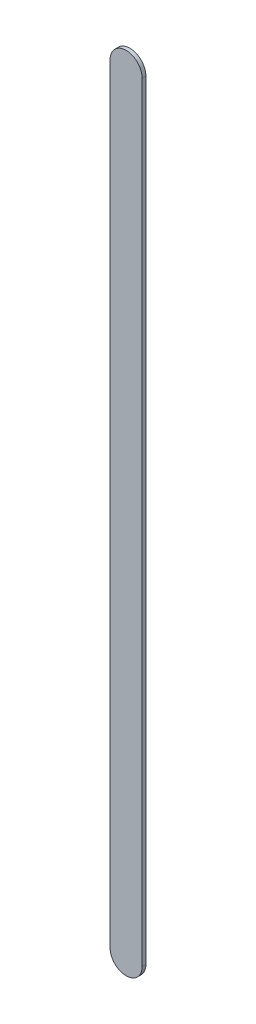
ISO-10303-21;
HEADER;
FILE_DESCRIPTION(('STEP AP214'),'2;1');
FILE_NAME('part.step','',(''),(''),'','','');
FILE_SCHEMA(('AUTOMOTIVE_DESIGN { 1 0 10303 214 1 1 1 1 }'));
ENDSEC;
DATA;
#1=APPLICATION_CONTEXT('core data for automotive mechanical design processes');
#2=APPLICATION_PROTOCOL_DEFINITION('international standard','automotive_design',2000,#1);
#3=PRODUCT_CONTEXT('',#1,'mechanical');
#4=PRODUCT('Part','Part','',(#3));
#5=PRODUCT_RELATED_PRODUCT_CATEGORY('part','',(#4));
#6=PRODUCT_DEFINITION_FORMATION('','',#4);
#7=PRODUCT_DEFINITION_CONTEXT('part definition',#1,'design');
#8=PRODUCT_DEFINITION('design','',#6,#7);
#9=PRODUCT_DEFINITION_SHAPE('','',#8);
#10=(LENGTH_UNIT() NAMED_UNIT(*) SI_UNIT(.MILLI.,.METRE.));
#11=(NAMED_UNIT(*) PLANE_ANGLE_UNIT() SI_UNIT($,.RADIAN.));
#12=(NAMED_UNIT(*) SI_UNIT($,.STERADIAN.) SOLID_ANGLE_UNIT());
#13=UNCERTAINTY_MEASURE_WITH_UNIT(LENGTH_MEASURE(1.E-05),#10,'distance_accuracy_value','');
#14=(GEOMETRIC_REPRESENTATION_CONTEXT(3) GLOBAL_UNCERTAINTY_ASSIGNED_CONTEXT((#13)) GLOBAL_UNIT_ASSIGNED_CONTEXT((#10,
#11,#12)) REPRESENTATION_CONTEXT('',''));
#15=CARTESIAN_POINT('',(0.,0.,0.));
#16=DIRECTION('',(0.,0.,1.));
#17=DIRECTION('',(1.,0.,0.));
#18=AXIS2_PLACEMENT_3D('',#15,#16,#17);
#19=CARTESIAN_POINT('',(124.43,-79.11,1.635));
#20=DIRECTION('',(0.,0.,1.));
#21=DIRECTION('',(1.,0.,0.));
#22=AXIS2_PLACEMENT_3D('',#19,#20,#21);
#23=PLANE('',#22);
#24=DIRECTION('',(0.,-1.,0.));
#25=VECTOR('',#24,1.);
#26=CARTESIAN_POINT('',(124.43,-79.11,1.635));
#27=LINE('',#26,#25);
#28=CARTESIAN_POINT('',(124.43,-79.11,1.635));
#29=VERTEX_POINT('',#28);
#30=CARTESIAN_POINT('',(124.43,-86.31,1.635));
#31=VERTEX_POINT('',#30);
#32=EDGE_CURVE('E82',#29,#31,#27,.T.);
#33=ORIENTED_EDGE('',*,*,#32,.T.);
#34=CARTESIAN_POINT('',(124.58,-86.31,1.635));
#35=DIRECTION('',(0.,0.,1.));
#36=DIRECTION('',(-1.,0.,0.));
#37=AXIS2_PLACEMENT_3D('',#34,#35,#36);
#38=CIRCLE('',#37,0.15);
#39=CARTESIAN_POINT('',(124.73,-86.31,1.635));
#40=VERTEX_POINT('',#39);
#41=EDGE_CURVE('E80',#31,#40,#38,.T.);
#42=ORIENTED_EDGE('',*,*,#41,.T.);
#43=DIRECTION('',(0.,1.,0.));
#44=VECTOR('',#43,1.);
#45=CARTESIAN_POINT('',(124.73,-86.31,1.635));
#46=LINE('',#45,#44);
#47=CARTESIAN_POINT('',(124.73,-79.11,1.635));
#48=VERTEX_POINT('',#47);
#49=EDGE_CURVE('E69',#40,#48,#46,.T.);
#50=ORIENTED_EDGE('',*,*,#49,.T.);
#51=CARTESIAN_POINT('',(124.58,-79.11,1.635));
#52=DIRECTION('',(0.,0.,1.));
#53=DIRECTION('',(1.,0.,0.));
#54=AXIS2_PLACEMENT_3D('',#51,#52,#53);
#55=CIRCLE('',#54,0.15);
#56=EDGE_CURVE('E11',#48,#29,#55,.T.);
#57=ORIENTED_EDGE('',*,*,#56,.T.);
#58=EDGE_LOOP('',(#33,#42,#50,#57));
#59=FACE_BOUND('',#58,.T.);
#60=ADVANCED_FACE('F17',(#59),#23,.T.);
#61=CARTESIAN_POINT('',(124.43,-79.11,1.6));
#62=DIRECTION('',(0.,0.,1.));
#63=DIRECTION('',(1.,0.,0.));
#64=AXIS2_PLACEMENT_3D('',#61,#62,#63);
#65=PLANE('',#64);
#66=CARTESIAN_POINT('',(124.58,-79.11,1.6));
#67=DIRECTION('',(0.,0.,1.));
#68=DIRECTION('',(1.,0.,0.));
#69=AXIS2_PLACEMENT_3D('',#66,#67,#68);
#70=CIRCLE('',#69,0.15);
#71=CARTESIAN_POINT('',(124.73,-79.11,1.6));
#72=VERTEX_POINT('',#71);
#73=CARTESIAN_POINT('',(124.43,-79.11,1.6));
#74=VERTEX_POINT('',#73);
#75=EDGE_CURVE('E20',#72,#74,#70,.T.);
#76=ORIENTED_EDGE('',*,*,#75,.F.);
#77=DIRECTION('',(0.,1.,0.));
#78=VECTOR('',#77,1.);
#79=CARTESIAN_POINT('',(124.73,-86.31,1.6));
#80=LINE('',#79,#78);
#81=CARTESIAN_POINT('',(124.73,-86.31,1.6));
#82=VERTEX_POINT('',#81);
#83=EDGE_CURVE('E62',#82,#72,#80,.T.);
#84=ORIENTED_EDGE('',*,*,#83,.F.);
#85=CARTESIAN_POINT('',(124.58,-86.31,1.6));
#86=DIRECTION('',(0.,0.,1.));
#87=DIRECTION('',(-1.,0.,0.));
#88=AXIS2_PLACEMENT_3D('',#85,#86,#87);
#89=CIRCLE('',#88,0.15);
#90=CARTESIAN_POINT('',(124.43,-86.31,1.6));
#91=VERTEX_POINT('',#90);
#92=EDGE_CURVE('E89',#91,#82,#89,.T.);
#93=ORIENTED_EDGE('',*,*,#92,.F.);
#94=DIRECTION('',(0.,-1.,0.));
#95=VECTOR('',#94,1.);
#96=CARTESIAN_POINT('',(124.43,-79.11,1.6));
#97=LINE('',#96,#95);
#98=EDGE_CURVE('E138',#74,#91,#97,.T.);
#99=ORIENTED_EDGE('',*,*,#98,.F.);
#100=EDGE_LOOP('',(#76,#84,#93,#99));
#101=FACE_BOUND('',#100,.T.);
#102=ADVANCED_FACE('F150',(#101),#65,.F.);
#103=CARTESIAN_POINT('',(124.58,-79.11,1.6));
#104=DIRECTION('',(0.,0.,-1.));
#105=DIRECTION('',(1.,0.,0.));
#106=AXIS2_PLACEMENT_3D('',#103,#104,#105);
#107=CYLINDRICAL_SURFACE('',#106,0.15);
#108=ORIENTED_EDGE('',*,*,#75,.T.);
#109=DIRECTION('',(0.,0.,1.));
#110=VECTOR('',#109,1.);
#111=CARTESIAN_POINT('',(124.43,-79.11,1.6));
#112=LINE('',#111,#110);
#113=EDGE_CURVE('E96',#74,#29,#112,.T.);
#114=ORIENTED_EDGE('',*,*,#113,.T.);
#115=ORIENTED_EDGE('',*,*,#56,.F.);
#116=DIRECTION('',(0.,0.,1.));
#117=VECTOR('',#116,1.);
#118=CARTESIAN_POINT('',(124.73,-79.11,1.6));
#119=LINE('',#118,#117);
#120=EDGE_CURVE('E75',#72,#48,#119,.T.);
#121=ORIENTED_EDGE('',*,*,#120,.F.);
#122=EDGE_LOOP('',(#108,#114,#115,#121));
#123=FACE_BOUND('',#122,.T.);
#124=ADVANCED_FACE('F154',(#123),#107,.T.);
#125=CARTESIAN_POINT('',(124.73,-86.31,1.6));
#126=DIRECTION('',(-1.,0.,0.));
#127=DIRECTION('',(0.,0.,1.));
#128=AXIS2_PLACEMENT_3D('',#125,#126,#127);
#129=PLANE('',#128);
#130=ORIENTED_EDGE('',*,*,#83,.T.);
#131=ORIENTED_EDGE('',*,*,#120,.T.);
#132=ORIENTED_EDGE('',*,*,#49,.F.);
#133=DIRECTION('',(0.,0.,1.));
#134=VECTOR('',#133,1.);
#135=CARTESIAN_POINT('',(124.73,-86.31,1.6));
#136=LINE('',#135,#134);
#137=EDGE_CURVE('E73',#82,#40,#136,.T.);
#138=ORIENTED_EDGE('',*,*,#137,.F.);
#139=EDGE_LOOP('',(#130,#131,#132,#138));
#140=FACE_BOUND('',#139,.T.);
#141=ADVANCED_FACE('F71',(#140),#129,.F.);
#142=CARTESIAN_POINT('',(124.58,-86.31,1.6));
#143=DIRECTION('',(0.,0.,-1.));
#144=DIRECTION('',(-1.,0.,0.));
#145=AXIS2_PLACEMENT_3D('',#142,#143,#144);
#146=CYLINDRICAL_SURFACE('',#145,0.15);
#147=ORIENTED_EDGE('',*,*,#92,.T.);
#148=ORIENTED_EDGE('',*,*,#137,.T.);
#149=ORIENTED_EDGE('',*,*,#41,.F.);
#150=DIRECTION('',(0.,0.,1.));
#151=VECTOR('',#150,1.);
#152=CARTESIAN_POINT('',(124.43,-86.31,1.6));
#153=LINE('',#152,#151);
#154=EDGE_CURVE('E130',#91,#31,#153,.T.);
#155=ORIENTED_EDGE('',*,*,#154,.F.);
#156=EDGE_LOOP('',(#147,#148,#149,#155));
#157=FACE_BOUND('',#156,.T.);
#158=ADVANCED_FACE('F88',(#157),#146,.T.);
#159=CARTESIAN_POINT('',(124.43,-79.11,1.6));
#160=DIRECTION('',(1.,0.,0.));
#161=DIRECTION('',(0.,1.,0.));
#162=AXIS2_PLACEMENT_3D('',#159,#160,#161);
#163=PLANE('',#162);
#164=ORIENTED_EDGE('',*,*,#98,.T.);
#165=ORIENTED_EDGE('',*,*,#154,.T.);
#166=ORIENTED_EDGE('',*,*,#32,.F.);
#167=ORIENTED_EDGE('',*,*,#113,.F.);
#168=EDGE_LOOP('',(#164,#165,#166,#167));
#169=FACE_BOUND('',#168,.T.);
#170=ADVANCED_FACE('F149',(#169),#163,.F.);
#171=CLOSED_SHELL('',(#60,#102,#124,#141,#158,#170));
#172=MANIFOLD_SOLID_BREP('B1',#171);
#173=ADVANCED_BREP_SHAPE_REPRESENTATION('',(#18,#172),#14);
#174=SHAPE_DEFINITION_REPRESENTATION(#9,#173);
ENDSEC;
END-ISO-10303-21;
